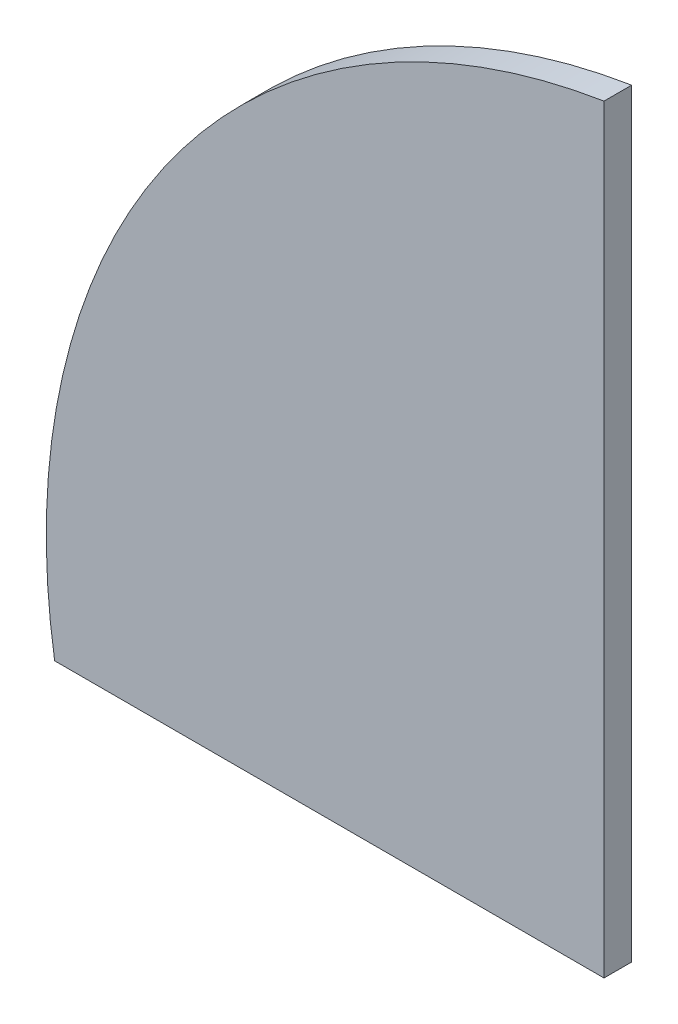
ISO-10303-21;
HEADER;
FILE_DESCRIPTION(('STEP AP214'),'2;1');
FILE_NAME('part.step','',(''),(''),'','','');
FILE_SCHEMA(('AUTOMOTIVE_DESIGN { 1 0 10303 214 1 1 1 1 }'));
ENDSEC;
DATA;
#1=APPLICATION_CONTEXT('core data for automotive mechanical design processes');
#2=APPLICATION_PROTOCOL_DEFINITION('international standard','automotive_design',2000,#1);
#3=PRODUCT_CONTEXT('',#1,'mechanical');
#4=PRODUCT('Part','Part','',(#3));
#5=PRODUCT_RELATED_PRODUCT_CATEGORY('part','',(#4));
#6=PRODUCT_DEFINITION_FORMATION('','',#4);
#7=PRODUCT_DEFINITION_CONTEXT('part definition',#1,'design');
#8=PRODUCT_DEFINITION('design','',#6,#7);
#9=PRODUCT_DEFINITION_SHAPE('','',#8);
#10=(LENGTH_UNIT() NAMED_UNIT(*) SI_UNIT(.MILLI.,.METRE.));
#11=(NAMED_UNIT(*) PLANE_ANGLE_UNIT() SI_UNIT($,.RADIAN.));
#12=(NAMED_UNIT(*) SI_UNIT($,.STERADIAN.) SOLID_ANGLE_UNIT());
#13=UNCERTAINTY_MEASURE_WITH_UNIT(LENGTH_MEASURE(1.E-05),#10,'distance_accuracy_value','');
#14=(GEOMETRIC_REPRESENTATION_CONTEXT(3) GLOBAL_UNCERTAINTY_ASSIGNED_CONTEXT((#13)) GLOBAL_UNIT_ASSIGNED_CONTEXT((#10,
#11,#12)) REPRESENTATION_CONTEXT('',''));
#15=CARTESIAN_POINT('',(0.,0.,0.));
#16=DIRECTION('',(0.,0.,1.));
#17=DIRECTION('',(1.,0.,0.));
#18=AXIS2_PLACEMENT_3D('',#15,#16,#17);
#19=CARTESIAN_POINT('',(-38.1000196782588,236.956511833957,10.));
#20=DIRECTION('',(-1.,0.,0.));
#21=DIRECTION('',(0.,-1.,0.));
#22=AXIS2_PLACEMENT_3D('',#19,#20,#21);
#23=PLANE('',#22);
#24=DIRECTION('',(0.,1.,0.));
#25=VECTOR('',#24,1.);
#26=CARTESIAN_POINT('',(-38.1000196782588,236.956511833957,0.));
#27=LINE('',#26,#25);
#28=CARTESIAN_POINT('',(-38.1000196782588,-37.9677871257001,0.));
#29=VERTEX_POINT('',#28);
#30=CARTESIAN_POINT('',(-38.1000196782588,236.956511833957,0.));
#31=VERTEX_POINT('',#30);
#32=EDGE_CURVE('E63',#29,#31,#27,.T.);
#33=ORIENTED_EDGE('',*,*,#32,.T.);
#34=DIRECTION('',(0.,0.,-1.));
#35=VECTOR('',#34,1.);
#36=CARTESIAN_POINT('',(-38.1000196782588,236.956511833957,10.));
#37=LINE('',#36,#35);
#38=CARTESIAN_POINT('',(-38.1000196782588,236.956511833957,10.));
#39=VERTEX_POINT('',#38);
#40=EDGE_CURVE('E41',#39,#31,#37,.T.);
#41=ORIENTED_EDGE('',*,*,#40,.F.);
#42=DIRECTION('',(0.,1.,0.));
#43=VECTOR('',#42,1.);
#44=CARTESIAN_POINT('',(-38.1000196782588,236.956511833957,10.));
#45=LINE('',#44,#43);
#46=CARTESIAN_POINT('',(-38.1000196782588,-37.9677871257001,10.));
#47=VERTEX_POINT('',#46);
#48=EDGE_CURVE('E71',#47,#39,#45,.T.);
#49=ORIENTED_EDGE('',*,*,#48,.F.);
#50=DIRECTION('',(0.,0.,-1.));
#51=VECTOR('',#50,1.);
#52=CARTESIAN_POINT('',(-38.1000196782588,-37.9677871257001,10.));
#53=LINE('',#52,#51);
#54=EDGE_CURVE('E11',#47,#29,#53,.T.);
#55=ORIENTED_EDGE('',*,*,#54,.T.);
#56=EDGE_LOOP('',(#33,#41,#49,#55));
#57=FACE_BOUND('',#56,.T.);
#58=ADVANCED_FACE('F33',(#57),#23,.F.);
#59=CARTESIAN_POINT('',(0.,0.,10.));
#60=DIRECTION('',(0.,0.,-1.));
#61=DIRECTION('',(-1.,0.,0.));
#62=AXIS2_PLACEMENT_3D('',#59,#60,#61);
#63=CYLINDRICAL_SURFACE('',#62,240.);
#64=CARTESIAN_POINT('',(0.,0.,0.));
#65=DIRECTION('',(0.,0.,1.));
#66=DIRECTION('',(1.,0.,0.));
#67=AXIS2_PLACEMENT_3D('',#64,#65,#66);
#68=CIRCLE('',#67,240.);
#69=CARTESIAN_POINT('',(-236.977735538125,-37.9677871257001,0.));
#70=VERTEX_POINT('',#69);
#71=EDGE_CURVE('E69',#31,#70,#68,.T.);
#72=ORIENTED_EDGE('',*,*,#71,.T.);
#73=DIRECTION('',(0.,0.,-1.));
#74=VECTOR('',#73,1.);
#75=CARTESIAN_POINT('',(-236.977735538125,-37.9677871257001,10.));
#76=LINE('',#75,#74);
#77=CARTESIAN_POINT('',(-236.977735538125,-37.9677871257001,10.));
#78=VERTEX_POINT('',#77);
#79=EDGE_CURVE('E81',#78,#70,#76,.T.);
#80=ORIENTED_EDGE('',*,*,#79,.F.);
#81=CARTESIAN_POINT('',(0.,0.,10.));
#82=DIRECTION('',(0.,0.,1.));
#83=DIRECTION('',(1.,0.,0.));
#84=AXIS2_PLACEMENT_3D('',#81,#82,#83);
#85=CIRCLE('',#84,240.);
#86=EDGE_CURVE('E74',#39,#78,#85,.T.);
#87=ORIENTED_EDGE('',*,*,#86,.F.);
#88=ORIENTED_EDGE('',*,*,#40,.T.);
#89=EDGE_LOOP('',(#72,#80,#87,#88));
#90=FACE_BOUND('',#89,.T.);
#91=ADVANCED_FACE('F89',(#90),#63,.T.);
#92=CARTESIAN_POINT('',(-226.844543996054,-37.9677871257001,10.));
#93=DIRECTION('',(0.,1.,0.));
#94=DIRECTION('',(-1.,0.,0.));
#95=AXIS2_PLACEMENT_3D('',#92,#93,#94);
#96=PLANE('',#95);
#97=DIRECTION('',(1.,0.,0.));
#98=VECTOR('',#97,1.);
#99=CARTESIAN_POINT('',(-226.844543996054,-37.9677871257001,0.));
#100=LINE('',#99,#98);
#101=EDGE_CURVE('E77',#70,#29,#100,.T.);
#102=ORIENTED_EDGE('',*,*,#101,.T.);
#103=ORIENTED_EDGE('',*,*,#54,.F.);
#104=DIRECTION('',(1.,0.,0.));
#105=VECTOR('',#104,1.);
#106=CARTESIAN_POINT('',(-38.1000196782588,-37.9677871257001,10.));
#107=LINE('',#106,#105);
#108=EDGE_CURVE('E49',#78,#47,#107,.T.);
#109=ORIENTED_EDGE('',*,*,#108,.F.);
#110=ORIENTED_EDGE('',*,*,#79,.T.);
#111=EDGE_LOOP('',(#102,#103,#109,#110));
#112=FACE_BOUND('',#111,.T.);
#113=ADVANCED_FACE('F79',(#112),#96,.F.);
#114=CARTESIAN_POINT('',(0.,0.,10.));
#115=DIRECTION('',(0.,0.,1.));
#116=DIRECTION('',(1.,0.,0.));
#117=AXIS2_PLACEMENT_3D('',#114,#115,#116);
#118=PLANE('',#117);
#119=ORIENTED_EDGE('',*,*,#108,.T.);
#120=ORIENTED_EDGE('',*,*,#48,.T.);
#121=ORIENTED_EDGE('',*,*,#86,.T.);
#122=EDGE_LOOP('',(#119,#120,#121));
#123=FACE_BOUND('',#122,.T.);
#124=ADVANCED_FACE('F76',(#123),#118,.T.);
#125=CARTESIAN_POINT('',(0.,0.,0.));
#126=DIRECTION('',(0.,0.,1.));
#127=DIRECTION('',(1.,0.,0.));
#128=AXIS2_PLACEMENT_3D('',#125,#126,#127);
#129=PLANE('',#128);
#130=ORIENTED_EDGE('',*,*,#32,.F.);
#131=ORIENTED_EDGE('',*,*,#101,.F.);
#132=ORIENTED_EDGE('',*,*,#71,.F.);
#133=EDGE_LOOP('',(#130,#131,#132));
#134=FACE_BOUND('',#133,.T.);
#135=ADVANCED_FACE('F84',(#134),#129,.F.);
#136=CLOSED_SHELL('',(#58,#91,#113,#124,#135));
#137=MANIFOLD_SOLID_BREP('B2',#136);
#138=ADVANCED_BREP_SHAPE_REPRESENTATION('',(#18,#137),#14);
#139=SHAPE_DEFINITION_REPRESENTATION(#9,#138);
ENDSEC;
END-ISO-10303-21;
